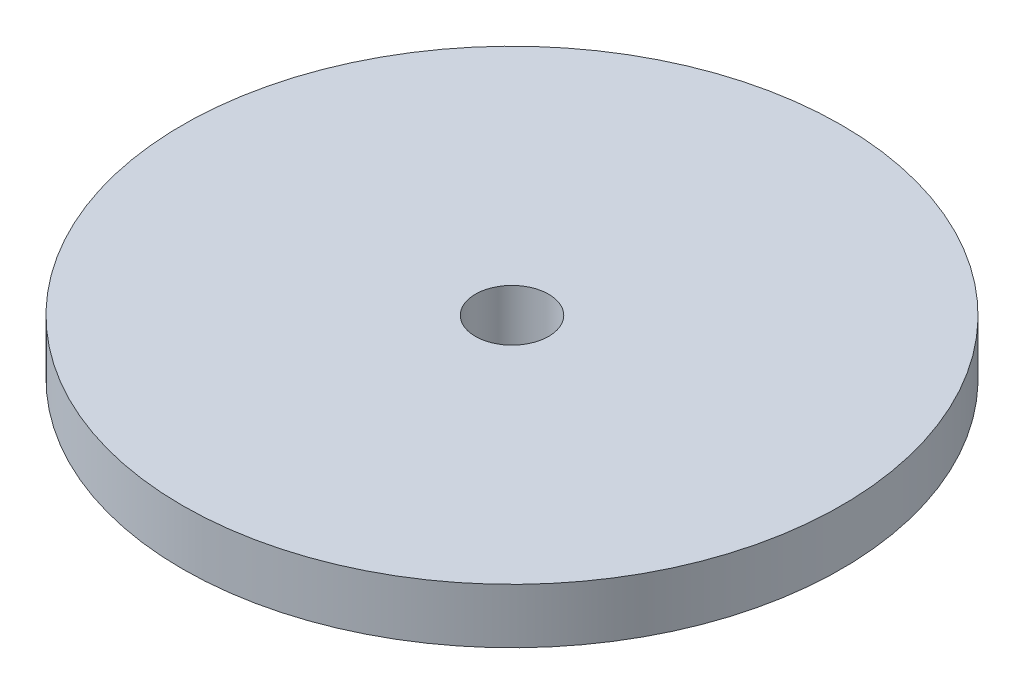
ISO-10303-21;
HEADER;
FILE_DESCRIPTION(('STEP AP214'),'2;1');
FILE_NAME('part.step','',(''),(''),'','','');
FILE_SCHEMA(('AUTOMOTIVE_DESIGN { 1 0 10303 214 1 1 1 1 }'));
ENDSEC;
DATA;
#1=APPLICATION_CONTEXT('core data for automotive mechanical design processes');
#2=APPLICATION_PROTOCOL_DEFINITION('international standard','automotive_design',2000,#1);
#3=PRODUCT_CONTEXT('',#1,'mechanical');
#4=PRODUCT('Part','Part','',(#3));
#5=PRODUCT_RELATED_PRODUCT_CATEGORY('part','',(#4));
#6=PRODUCT_DEFINITION_FORMATION('','',#4);
#7=PRODUCT_DEFINITION_CONTEXT('part definition',#1,'design');
#8=PRODUCT_DEFINITION('design','',#6,#7);
#9=PRODUCT_DEFINITION_SHAPE('','',#8);
#10=(LENGTH_UNIT() NAMED_UNIT(*) SI_UNIT(.MILLI.,.METRE.));
#11=(NAMED_UNIT(*) PLANE_ANGLE_UNIT() SI_UNIT($,.RADIAN.));
#12=(NAMED_UNIT(*) SI_UNIT($,.STERADIAN.) SOLID_ANGLE_UNIT());
#13=UNCERTAINTY_MEASURE_WITH_UNIT(LENGTH_MEASURE(1.E-05),#10,'distance_accuracy_value','');
#14=(GEOMETRIC_REPRESENTATION_CONTEXT(3) GLOBAL_UNCERTAINTY_ASSIGNED_CONTEXT((#13)) GLOBAL_UNIT_ASSIGNED_CONTEXT((#10,
#11,#12)) REPRESENTATION_CONTEXT('',''));
#15=CARTESIAN_POINT('',(0.,0.,0.));
#16=DIRECTION('',(0.,0.,1.));
#17=DIRECTION('',(1.,0.,0.));
#18=AXIS2_PLACEMENT_3D('',#15,#16,#17);
#19=CARTESIAN_POINT('',(0.,15.,0.));
#20=DIRECTION('',(0.,1.,0.));
#21=DIRECTION('',(0.,0.,1.));
#22=AXIS2_PLACEMENT_3D('',#19,#20,#21);
#23=PLANE('',#22);
#24=CARTESIAN_POINT('',(0.,15.,0.));
#25=DIRECTION('',(0.,1.,0.));
#26=DIRECTION('',(0.,0.,1.));
#27=AXIS2_PLACEMENT_3D('',#24,#25,#26);
#28=CIRCLE('',#27,90.);
#29=CARTESIAN_POINT('',(0.,15.,90.));
#30=VERTEX_POINT('',#29);
#31=EDGE_CURVE('E10',#30,#30,#28,.T.);
#32=ORIENTED_EDGE('',*,*,#31,.T.);
#33=EDGE_LOOP('',(#32));
#34=FACE_BOUND('',#33,.T.);
#35=CARTESIAN_POINT('',(0.,15.,0.));
#36=DIRECTION('',(0.,1.,0.));
#37=DIRECTION('',(0.,0.,1.));
#38=AXIS2_PLACEMENT_3D('',#35,#36,#37);
#39=CIRCLE('',#38,10.);
#40=CARTESIAN_POINT('',(0.,15.,10.));
#41=VERTEX_POINT('',#40);
#42=EDGE_CURVE('E57',#41,#41,#39,.T.);
#43=ORIENTED_EDGE('',*,*,#42,.F.);
#44=EDGE_LOOP('',(#43));
#45=FACE_BOUND('',#44,.T.);
#46=ADVANCED_FACE('F43',(#34,#45),#23,.T.);
#47=CARTESIAN_POINT('',(0.,0.,0.));
#48=DIRECTION('',(0.,1.,0.));
#49=DIRECTION('',(0.,0.,1.));
#50=AXIS2_PLACEMENT_3D('',#47,#48,#49);
#51=PLANE('',#50);
#52=CARTESIAN_POINT('',(0.,0.,0.));
#53=DIRECTION('',(0.,1.,0.));
#54=DIRECTION('',(0.,0.,1.));
#55=AXIS2_PLACEMENT_3D('',#52,#53,#54);
#56=CIRCLE('',#55,90.);
#57=CARTESIAN_POINT('',(0.,0.,90.));
#58=VERTEX_POINT('',#57);
#59=EDGE_CURVE('E50',#58,#58,#56,.T.);
#60=ORIENTED_EDGE('',*,*,#59,.F.);
#61=EDGE_LOOP('',(#60));
#62=FACE_BOUND('',#61,.T.);
#63=CARTESIAN_POINT('',(0.,0.,0.));
#64=DIRECTION('',(0.,1.,0.));
#65=DIRECTION('',(0.,0.,1.));
#66=AXIS2_PLACEMENT_3D('',#63,#64,#65);
#67=CIRCLE('',#66,10.);
#68=CARTESIAN_POINT('',(0.,0.,10.));
#69=VERTEX_POINT('',#68);
#70=EDGE_CURVE('E59',#69,#69,#67,.T.);
#71=ORIENTED_EDGE('',*,*,#70,.T.);
#72=EDGE_LOOP('',(#71));
#73=FACE_BOUND('',#72,.T.);
#74=ADVANCED_FACE('F69',(#62,#73),#51,.F.);
#75=CARTESIAN_POINT('',(0.,15.,0.));
#76=DIRECTION('',(0.,-1.,0.));
#77=DIRECTION('',(0.,0.,-1.));
#78=AXIS2_PLACEMENT_3D('',#75,#76,#77);
#79=CYLINDRICAL_SURFACE('',#78,90.);
#80=ORIENTED_EDGE('',*,*,#31,.F.);
#81=EDGE_LOOP('',(#80));
#82=FACE_BOUND('',#81,.T.);
#83=ORIENTED_EDGE('',*,*,#59,.T.);
#84=EDGE_LOOP('',(#83));
#85=FACE_BOUND('',#84,.T.);
#86=ADVANCED_FACE('F44',(#82,#85),#79,.T.);
#87=CARTESIAN_POINT('',(0.,15.,0.));
#88=DIRECTION('',(0.,-1.,0.));
#89=DIRECTION('',(0.,0.,-1.));
#90=AXIS2_PLACEMENT_3D('',#87,#88,#89);
#91=CYLINDRICAL_SURFACE('',#90,10.);
#92=ORIENTED_EDGE('',*,*,#42,.T.);
#93=EDGE_LOOP('',(#92));
#94=FACE_BOUND('',#93,.T.);
#95=ORIENTED_EDGE('',*,*,#70,.F.);
#96=EDGE_LOOP('',(#95));
#97=FACE_BOUND('',#96,.T.);
#98=ADVANCED_FACE('F66',(#94,#97),#91,.F.);
#99=CLOSED_SHELL('',(#46,#74,#86,#98));
#100=MANIFOLD_SOLID_BREP('B2',#99);
#101=ADVANCED_BREP_SHAPE_REPRESENTATION('',(#18,#100),#14);
#102=SHAPE_DEFINITION_REPRESENTATION(#9,#101);
ENDSEC;
END-ISO-10303-21;
